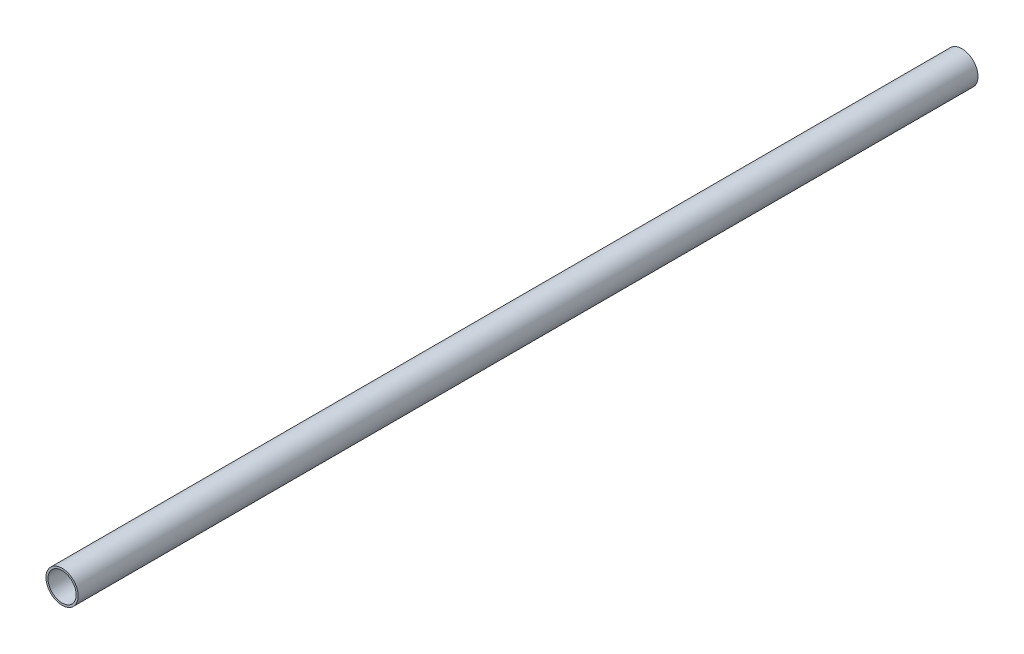
ISO-10303-21;
HEADER;
FILE_DESCRIPTION(('STEP AP214'),'2;1');
FILE_NAME('part.step','',(''),(''),'','','');
FILE_SCHEMA(('AUTOMOTIVE_DESIGN { 1 0 10303 214 1 1 1 1 }'));
ENDSEC;
DATA;
#1=APPLICATION_CONTEXT('core data for automotive mechanical design processes');
#2=APPLICATION_PROTOCOL_DEFINITION('international standard','automotive_design',2000,#1);
#3=PRODUCT_CONTEXT('',#1,'mechanical');
#4=PRODUCT('Part','Part','',(#3));
#5=PRODUCT_RELATED_PRODUCT_CATEGORY('part','',(#4));
#6=PRODUCT_DEFINITION_FORMATION('','',#4);
#7=PRODUCT_DEFINITION_CONTEXT('part definition',#1,'design');
#8=PRODUCT_DEFINITION('design','',#6,#7);
#9=PRODUCT_DEFINITION_SHAPE('','',#8);
#10=(LENGTH_UNIT() NAMED_UNIT(*) SI_UNIT(.MILLI.,.METRE.));
#11=(NAMED_UNIT(*) PLANE_ANGLE_UNIT() SI_UNIT($,.RADIAN.));
#12=(NAMED_UNIT(*) SI_UNIT($,.STERADIAN.) SOLID_ANGLE_UNIT());
#13=UNCERTAINTY_MEASURE_WITH_UNIT(LENGTH_MEASURE(1.E-05),#10,'distance_accuracy_value','');
#14=(GEOMETRIC_REPRESENTATION_CONTEXT(3) GLOBAL_UNCERTAINTY_ASSIGNED_CONTEXT((#13)) GLOBAL_UNIT_ASSIGNED_CONTEXT((#10,
#11,#12)) REPRESENTATION_CONTEXT('',''));
#15=CARTESIAN_POINT('',(0.,0.,0.));
#16=DIRECTION('',(0.,0.,1.));
#17=DIRECTION('',(1.,0.,0.));
#18=AXIS2_PLACEMENT_3D('',#15,#16,#17);
#19=CARTESIAN_POINT('',(0.,4.83869999999998,135.255));
#20=DIRECTION('',(0.,0.,-1.));
#21=DIRECTION('',(-1.,0.,0.));
#22=AXIS2_PLACEMENT_3D('',#19,#20,#21);
#23=PLANE('',#22);
#24=CARTESIAN_POINT('',(0.,0.,135.255));
#25=DIRECTION('',(0.,0.,1.));
#26=DIRECTION('',(1.,0.,0.));
#27=AXIS2_PLACEMENT_3D('',#24,#25,#26);
#28=CIRCLE('',#27,4.22910000000001);
#29=CARTESIAN_POINT('',(4.22910000000001,0.,135.255));
#30=VERTEX_POINT('',#29);
#31=EDGE_CURVE('E10',#30,#30,#28,.T.);
#32=ORIENTED_EDGE('',*,*,#31,.F.);
#33=EDGE_LOOP('',(#32));
#34=FACE_BOUND('',#33,.T.);
#35=CARTESIAN_POINT('',(0.,0.,135.255));
#36=DIRECTION('',(0.,0.,1.));
#37=DIRECTION('',(1.,0.,0.));
#38=AXIS2_PLACEMENT_3D('',#35,#36,#37);
#39=CIRCLE('',#38,4.83869999999998);
#40=CARTESIAN_POINT('',(4.83869999999998,0.,135.255));
#41=VERTEX_POINT('',#40);
#42=EDGE_CURVE('E47',#41,#41,#39,.T.);
#43=ORIENTED_EDGE('',*,*,#42,.T.);
#44=EDGE_LOOP('',(#43));
#45=FACE_BOUND('',#44,.T.);
#46=ADVANCED_FACE('F33',(#34,#45),#23,.F.);
#47=CARTESIAN_POINT('',(0.,0.,28.6287087923889));
#48=DIRECTION('',(0.,0.,1.));
#49=DIRECTION('',(1.,0.,0.));
#50=AXIS2_PLACEMENT_3D('',#47,#48,#49);
#51=CYLINDRICAL_SURFACE('',#50,4.22910000000001);
#52=CARTESIAN_POINT('',(0.,0.,-135.255));
#53=DIRECTION('',(0.,0.,1.));
#54=DIRECTION('',(1.,0.,0.));
#55=AXIS2_PLACEMENT_3D('',#52,#53,#54);
#56=CIRCLE('',#55,4.22910000000001);
#57=CARTESIAN_POINT('',(4.22910000000001,0.,-135.255));
#58=VERTEX_POINT('',#57);
#59=EDGE_CURVE('E39',#58,#58,#56,.T.);
#60=ORIENTED_EDGE('',*,*,#59,.F.);
#61=EDGE_LOOP('',(#60));
#62=FACE_BOUND('',#61,.T.);
#63=ORIENTED_EDGE('',*,*,#31,.T.);
#64=EDGE_LOOP('',(#63));
#65=FACE_BOUND('',#64,.T.);
#66=ADVANCED_FACE('F62',(#62,#65),#51,.F.);
#67=CARTESIAN_POINT('',(0.,4.22910000000001,-135.255));
#68=DIRECTION('',(0.,0.,1.));
#69=DIRECTION('',(1.,0.,0.));
#70=AXIS2_PLACEMENT_3D('',#67,#68,#69);
#71=PLANE('',#70);
#72=CARTESIAN_POINT('',(0.,0.,-135.255));
#73=DIRECTION('',(0.,0.,1.));
#74=DIRECTION('',(1.,0.,0.));
#75=AXIS2_PLACEMENT_3D('',#72,#73,#74);
#76=CIRCLE('',#75,4.83870000000001);
#77=CARTESIAN_POINT('',(4.83870000000001,0.,-135.255));
#78=VERTEX_POINT('',#77);
#79=EDGE_CURVE('E43',#78,#78,#76,.T.);
#80=ORIENTED_EDGE('',*,*,#79,.F.);
#81=EDGE_LOOP('',(#80));
#82=FACE_BOUND('',#81,.T.);
#83=ORIENTED_EDGE('',*,*,#59,.T.);
#84=EDGE_LOOP('',(#83));
#85=FACE_BOUND('',#84,.T.);
#86=ADVANCED_FACE('F57',(#82,#85),#71,.F.);
#87=CARTESIAN_POINT('',(0.,0.,28.6287087923889));
#88=DIRECTION('',(0.,0.,1.));
#89=DIRECTION('',(1.,0.,0.));
#90=AXIS2_PLACEMENT_3D('',#87,#88,#89);
#91=CYLINDRICAL_SURFACE('',#90,4.83869999999999);
#92=ORIENTED_EDGE('',*,*,#42,.F.);
#93=EDGE_LOOP('',(#92));
#94=FACE_BOUND('',#93,.T.);
#95=ORIENTED_EDGE('',*,*,#79,.T.);
#96=EDGE_LOOP('',(#95));
#97=FACE_BOUND('',#96,.T.);
#98=ADVANCED_FACE('F54',(#94,#97),#91,.T.);
#99=CLOSED_SHELL('',(#46,#66,#86,#98));
#100=MANIFOLD_SOLID_BREP('B2',#99);
#101=ADVANCED_BREP_SHAPE_REPRESENTATION('',(#18,#100),#14);
#102=SHAPE_DEFINITION_REPRESENTATION(#9,#101);
ENDSEC;
END-ISO-10303-21;
